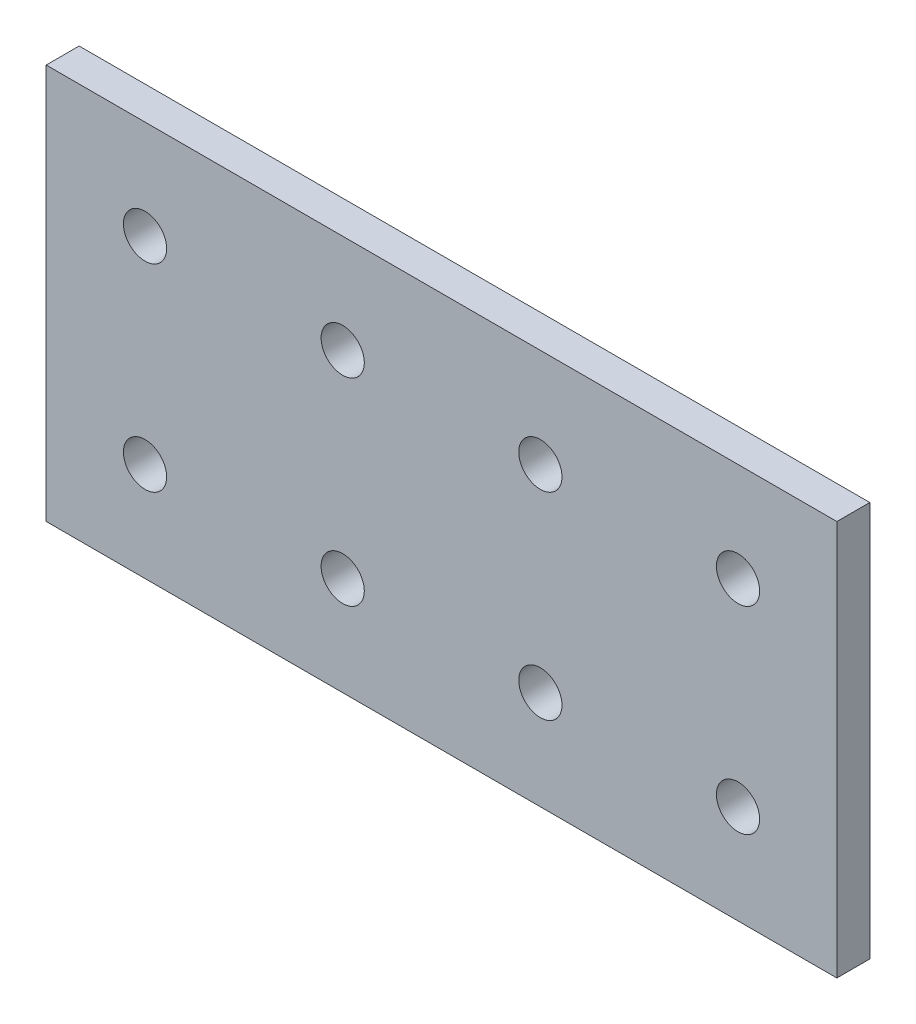
ISO-10303-21;
HEADER;
FILE_DESCRIPTION(('STEP AP214'),'2;1');
FILE_NAME('part.step','',(''),(''),'','','');
FILE_SCHEMA(('AUTOMOTIVE_DESIGN { 1 0 10303 214 1 1 1 1 }'));
ENDSEC;
DATA;
#1=APPLICATION_CONTEXT('core data for automotive mechanical design processes');
#2=APPLICATION_PROTOCOL_DEFINITION('international standard','automotive_design',2000,#1);
#3=PRODUCT_CONTEXT('',#1,'mechanical');
#4=PRODUCT('Part','Part','',(#3));
#5=PRODUCT_RELATED_PRODUCT_CATEGORY('part','',(#4));
#6=PRODUCT_DEFINITION_FORMATION('','',#4);
#7=PRODUCT_DEFINITION_CONTEXT('part definition',#1,'design');
#8=PRODUCT_DEFINITION('design','',#6,#7);
#9=PRODUCT_DEFINITION_SHAPE('','',#8);
#10=(LENGTH_UNIT() NAMED_UNIT(*) SI_UNIT(.MILLI.,.METRE.));
#11=(NAMED_UNIT(*) PLANE_ANGLE_UNIT() SI_UNIT($,.RADIAN.));
#12=(NAMED_UNIT(*) SI_UNIT($,.STERADIAN.) SOLID_ANGLE_UNIT());
#13=UNCERTAINTY_MEASURE_WITH_UNIT(LENGTH_MEASURE(1.E-05),#10,'distance_accuracy_value','');
#14=(GEOMETRIC_REPRESENTATION_CONTEXT(3) GLOBAL_UNCERTAINTY_ASSIGNED_CONTEXT((#13)) GLOBAL_UNIT_ASSIGNED_CONTEXT((#10,
#11,#12)) REPRESENTATION_CONTEXT('',''));
#15=CARTESIAN_POINT('',(0.,0.,0.));
#16=DIRECTION('',(0.,0.,1.));
#17=DIRECTION('',(1.,0.,0.));
#18=AXIS2_PLACEMENT_3D('',#15,#16,#17);
#19=CARTESIAN_POINT('',(0.,0.,3.175));
#20=DIRECTION('',(0.,0.,-1.));
#21=DIRECTION('',(-1.,0.,0.));
#22=AXIS2_PLACEMENT_3D('',#19,#20,#21);
#23=PLANE('',#22);
#24=CARTESIAN_POINT('',(95.25,57.15,3.175));
#25=DIRECTION('',(0.,0.,1.));
#26=DIRECTION('',(1.,0.,0.));
#27=AXIS2_PLACEMENT_3D('',#24,#25,#26);
#28=CIRCLE('',#27,4.1656);
#29=CARTESIAN_POINT('',(99.4156,57.15,3.175));
#30=VERTEX_POINT('',#29);
#31=EDGE_CURVE('E149',#30,#30,#28,.T.);
#32=ORIENTED_EDGE('',*,*,#31,.F.);
#33=EDGE_LOOP('',(#32));
#34=FACE_BOUND('',#33,.T.);
#35=CARTESIAN_POINT('',(19.05,57.15,3.175));
#36=DIRECTION('',(0.,0.,1.));
#37=DIRECTION('',(1.,0.,0.));
#38=AXIS2_PLACEMENT_3D('',#35,#36,#37);
#39=CIRCLE('',#38,4.1656);
#40=CARTESIAN_POINT('',(23.2156,57.15,3.175));
#41=VERTEX_POINT('',#40);
#42=EDGE_CURVE('E137',#41,#41,#39,.T.);
#43=ORIENTED_EDGE('',*,*,#42,.F.);
#44=EDGE_LOOP('',(#43));
#45=FACE_BOUND('',#44,.T.);
#46=CARTESIAN_POINT('',(95.25,19.05,3.175));
#47=DIRECTION('',(0.,0.,1.));
#48=DIRECTION('',(1.,0.,0.));
#49=AXIS2_PLACEMENT_3D('',#46,#47,#48);
#50=CIRCLE('',#49,4.1656);
#51=CARTESIAN_POINT('',(99.4156,19.05,3.175));
#52=VERTEX_POINT('',#51);
#53=EDGE_CURVE('E125',#52,#52,#50,.T.);
#54=ORIENTED_EDGE('',*,*,#53,.F.);
#55=EDGE_LOOP('',(#54));
#56=FACE_BOUND('',#55,.T.);
#57=CARTESIAN_POINT('',(19.05,19.05,3.175));
#58=DIRECTION('',(0.,0.,1.));
#59=DIRECTION('',(1.,0.,0.));
#60=AXIS2_PLACEMENT_3D('',#57,#58,#59);
#61=CIRCLE('',#60,4.1656);
#62=CARTESIAN_POINT('',(23.2156,19.05,3.175));
#63=VERTEX_POINT('',#62);
#64=EDGE_CURVE('E104',#63,#63,#61,.T.);
#65=ORIENTED_EDGE('',*,*,#64,.F.);
#66=EDGE_LOOP('',(#65));
#67=FACE_BOUND('',#66,.T.);
#68=DIRECTION('',(1.,0.,0.));
#69=VECTOR('',#68,1.);
#70=CARTESIAN_POINT('',(152.4,0.,3.175));
#71=LINE('',#70,#69);
#72=CARTESIAN_POINT('',(0.,0.,3.175));
#73=VERTEX_POINT('',#72);
#74=CARTESIAN_POINT('',(152.4,0.,3.175));
#75=VERTEX_POINT('',#74);
#76=EDGE_CURVE('E89',#73,#75,#71,.T.);
#77=ORIENTED_EDGE('',*,*,#76,.T.);
#78=DIRECTION('',(0.,1.,0.));
#79=VECTOR('',#78,1.);
#80=CARTESIAN_POINT('',(152.4,76.2,3.175));
#81=LINE('',#80,#79);
#82=CARTESIAN_POINT('',(152.4,76.2,3.175));
#83=VERTEX_POINT('',#82);
#84=EDGE_CURVE('E84',#75,#83,#81,.T.);
#85=ORIENTED_EDGE('',*,*,#84,.T.);
#86=DIRECTION('',(-1.,0.,0.));
#87=VECTOR('',#86,1.);
#88=CARTESIAN_POINT('',(152.4,76.2,3.175));
#89=LINE('',#88,#87);
#90=CARTESIAN_POINT('',(0.,76.2,3.175));
#91=VERTEX_POINT('',#90);
#92=EDGE_CURVE('E87',#83,#91,#89,.T.);
#93=ORIENTED_EDGE('',*,*,#92,.T.);
#94=DIRECTION('',(0.,-1.,0.));
#95=VECTOR('',#94,1.);
#96=CARTESIAN_POINT('',(0.,0.,3.175));
#97=LINE('',#96,#95);
#98=EDGE_CURVE('E54',#91,#73,#97,.T.);
#99=ORIENTED_EDGE('',*,*,#98,.T.);
#100=EDGE_LOOP('',(#77,#85,#93,#99));
#101=FACE_BOUND('',#100,.T.);
#102=CARTESIAN_POINT('',(57.15,19.05,3.175));
#103=DIRECTION('',(0.,0.,1.));
#104=DIRECTION('',(1.,0.,0.));
#105=AXIS2_PLACEMENT_3D('',#102,#103,#104);
#106=CIRCLE('',#105,4.1656);
#107=CARTESIAN_POINT('',(61.3156,19.05,3.175));
#108=VERTEX_POINT('',#107);
#109=EDGE_CURVE('E119',#108,#108,#106,.T.);
#110=ORIENTED_EDGE('',*,*,#109,.F.);
#111=EDGE_LOOP('',(#110));
#112=FACE_BOUND('',#111,.T.);
#113=CARTESIAN_POINT('',(133.35,19.05,3.175));
#114=DIRECTION('',(0.,0.,1.));
#115=DIRECTION('',(1.,0.,0.));
#116=AXIS2_PLACEMENT_3D('',#113,#114,#115);
#117=CIRCLE('',#116,4.1656);
#118=CARTESIAN_POINT('',(137.5156,19.05,3.175));
#119=VERTEX_POINT('',#118);
#120=EDGE_CURVE('E131',#119,#119,#117,.T.);
#121=ORIENTED_EDGE('',*,*,#120,.F.);
#122=EDGE_LOOP('',(#121));
#123=FACE_BOUND('',#122,.T.);
#124=CARTESIAN_POINT('',(57.15,57.15,3.175));
#125=DIRECTION('',(0.,0.,1.));
#126=DIRECTION('',(1.,0.,0.));
#127=AXIS2_PLACEMENT_3D('',#124,#125,#126);
#128=CIRCLE('',#127,4.1656);
#129=CARTESIAN_POINT('',(61.3156,57.15,3.175));
#130=VERTEX_POINT('',#129);
#131=EDGE_CURVE('E143',#130,#130,#128,.T.);
#132=ORIENTED_EDGE('',*,*,#131,.F.);
#133=EDGE_LOOP('',(#132));
#134=FACE_BOUND('',#133,.T.);
#135=CARTESIAN_POINT('',(133.35,57.15,3.175));
#136=DIRECTION('',(0.,0.,1.));
#137=DIRECTION('',(1.,0.,0.));
#138=AXIS2_PLACEMENT_3D('',#135,#136,#137);
#139=CIRCLE('',#138,4.1656);
#140=CARTESIAN_POINT('',(137.5156,57.15,3.175));
#141=VERTEX_POINT('',#140);
#142=EDGE_CURVE('E155',#141,#141,#139,.T.);
#143=ORIENTED_EDGE('',*,*,#142,.F.);
#144=EDGE_LOOP('',(#143));
#145=FACE_BOUND('',#144,.T.);
#146=ADVANCED_FACE('F37',(#34,#45,#56,#67,#101,#112,#123,#134,#145),#23,.F.);
#147=CARTESIAN_POINT('',(0.,0.,-3.175));
#148=DIRECTION('',(0.,0.,-1.));
#149=DIRECTION('',(-1.,0.,0.));
#150=AXIS2_PLACEMENT_3D('',#147,#148,#149);
#151=PLANE('',#150);
#152=CARTESIAN_POINT('',(95.25,57.15,-3.175));
#153=DIRECTION('',(0.,0.,1.));
#154=DIRECTION('',(1.,0.,0.));
#155=AXIS2_PLACEMENT_3D('',#152,#153,#154);
#156=CIRCLE('',#155,4.1656);
#157=CARTESIAN_POINT('',(99.4156,57.15,-3.175));
#158=VERTEX_POINT('',#157);
#159=EDGE_CURVE('E152',#158,#158,#156,.T.);
#160=ORIENTED_EDGE('',*,*,#159,.T.);
#161=EDGE_LOOP('',(#160));
#162=FACE_BOUND('',#161,.T.);
#163=CARTESIAN_POINT('',(19.05,57.15,-3.175));
#164=DIRECTION('',(0.,0.,1.));
#165=DIRECTION('',(1.,0.,0.));
#166=AXIS2_PLACEMENT_3D('',#163,#164,#165);
#167=CIRCLE('',#166,4.1656);
#168=CARTESIAN_POINT('',(23.2156,57.15,-3.175));
#169=VERTEX_POINT('',#168);
#170=EDGE_CURVE('E140',#169,#169,#167,.T.);
#171=ORIENTED_EDGE('',*,*,#170,.T.);
#172=EDGE_LOOP('',(#171));
#173=FACE_BOUND('',#172,.T.);
#174=CARTESIAN_POINT('',(95.25,19.05,-3.175));
#175=DIRECTION('',(0.,0.,1.));
#176=DIRECTION('',(1.,0.,0.));
#177=AXIS2_PLACEMENT_3D('',#174,#175,#176);
#178=CIRCLE('',#177,4.1656);
#179=CARTESIAN_POINT('',(99.4156,19.05,-3.175));
#180=VERTEX_POINT('',#179);
#181=EDGE_CURVE('E128',#180,#180,#178,.T.);
#182=ORIENTED_EDGE('',*,*,#181,.T.);
#183=EDGE_LOOP('',(#182));
#184=FACE_BOUND('',#183,.T.);
#185=CARTESIAN_POINT('',(19.05,19.05,-3.175));
#186=DIRECTION('',(0.,0.,1.));
#187=DIRECTION('',(1.,0.,0.));
#188=AXIS2_PLACEMENT_3D('',#185,#186,#187);
#189=CIRCLE('',#188,4.1656);
#190=CARTESIAN_POINT('',(23.2156,19.05,-3.175));
#191=VERTEX_POINT('',#190);
#192=EDGE_CURVE('E116',#191,#191,#189,.T.);
#193=ORIENTED_EDGE('',*,*,#192,.T.);
#194=EDGE_LOOP('',(#193));
#195=FACE_BOUND('',#194,.T.);
#196=DIRECTION('',(1.,0.,0.));
#197=VECTOR('',#196,1.);
#198=CARTESIAN_POINT('',(152.4,0.,-3.175));
#199=LINE('',#198,#197);
#200=CARTESIAN_POINT('',(0.,0.,-3.175));
#201=VERTEX_POINT('',#200);
#202=CARTESIAN_POINT('',(152.4,0.,-3.175));
#203=VERTEX_POINT('',#202);
#204=EDGE_CURVE('E101',#201,#203,#199,.T.);
#205=ORIENTED_EDGE('',*,*,#204,.F.);
#206=DIRECTION('',(0.,-1.,0.));
#207=VECTOR('',#206,1.);
#208=CARTESIAN_POINT('',(0.,0.,-3.175));
#209=LINE('',#208,#207);
#210=CARTESIAN_POINT('',(0.,76.2,-3.175));
#211=VERTEX_POINT('',#210);
#212=EDGE_CURVE('E77',#211,#201,#209,.T.);
#213=ORIENTED_EDGE('',*,*,#212,.F.);
#214=DIRECTION('',(-1.,0.,0.));
#215=VECTOR('',#214,1.);
#216=CARTESIAN_POINT('',(152.4,76.2,-3.175));
#217=LINE('',#216,#215);
#218=CARTESIAN_POINT('',(152.4,76.2,-3.175));
#219=VERTEX_POINT('',#218);
#220=EDGE_CURVE('E71',#219,#211,#217,.T.);
#221=ORIENTED_EDGE('',*,*,#220,.F.);
#222=DIRECTION('',(0.,1.,0.));
#223=VECTOR('',#222,1.);
#224=CARTESIAN_POINT('',(152.4,76.2,-3.175));
#225=LINE('',#224,#223);
#226=EDGE_CURVE('E93',#203,#219,#225,.T.);
#227=ORIENTED_EDGE('',*,*,#226,.F.);
#228=EDGE_LOOP('',(#205,#213,#221,#227));
#229=FACE_BOUND('',#228,.T.);
#230=CARTESIAN_POINT('',(57.15,19.05,-3.175));
#231=DIRECTION('',(0.,0.,1.));
#232=DIRECTION('',(1.,0.,0.));
#233=AXIS2_PLACEMENT_3D('',#230,#231,#232);
#234=CIRCLE('',#233,4.1656);
#235=CARTESIAN_POINT('',(61.3156,19.05,-3.175));
#236=VERTEX_POINT('',#235);
#237=EDGE_CURVE('E122',#236,#236,#234,.T.);
#238=ORIENTED_EDGE('',*,*,#237,.T.);
#239=EDGE_LOOP('',(#238));
#240=FACE_BOUND('',#239,.T.);
#241=CARTESIAN_POINT('',(133.35,19.05,-3.175));
#242=DIRECTION('',(0.,0.,1.));
#243=DIRECTION('',(1.,0.,0.));
#244=AXIS2_PLACEMENT_3D('',#241,#242,#243);
#245=CIRCLE('',#244,4.1656);
#246=CARTESIAN_POINT('',(137.5156,19.05,-3.175));
#247=VERTEX_POINT('',#246);
#248=EDGE_CURVE('E134',#247,#247,#245,.T.);
#249=ORIENTED_EDGE('',*,*,#248,.T.);
#250=EDGE_LOOP('',(#249));
#251=FACE_BOUND('',#250,.T.);
#252=CARTESIAN_POINT('',(57.15,57.15,-3.175));
#253=DIRECTION('',(0.,0.,1.));
#254=DIRECTION('',(1.,0.,0.));
#255=AXIS2_PLACEMENT_3D('',#252,#253,#254);
#256=CIRCLE('',#255,4.1656);
#257=CARTESIAN_POINT('',(61.3156,57.15,-3.175));
#258=VERTEX_POINT('',#257);
#259=EDGE_CURVE('E146',#258,#258,#256,.T.);
#260=ORIENTED_EDGE('',*,*,#259,.T.);
#261=EDGE_LOOP('',(#260));
#262=FACE_BOUND('',#261,.T.);
#263=CARTESIAN_POINT('',(133.35,57.15,-3.175));
#264=DIRECTION('',(0.,0.,1.));
#265=DIRECTION('',(1.,0.,0.));
#266=AXIS2_PLACEMENT_3D('',#263,#264,#265);
#267=CIRCLE('',#266,4.1656);
#268=CARTESIAN_POINT('',(137.5156,57.15,-3.175));
#269=VERTEX_POINT('',#268);
#270=EDGE_CURVE('E158',#269,#269,#267,.T.);
#271=ORIENTED_EDGE('',*,*,#270,.T.);
#272=EDGE_LOOP('',(#271));
#273=FACE_BOUND('',#272,.T.);
#274=ADVANCED_FACE('F112',(#162,#173,#184,#195,#229,#240,#251,#262,#273),#151,.T.);
#275=CARTESIAN_POINT('',(152.4,0.,3.175));
#276=DIRECTION('',(0.,1.,0.));
#277=DIRECTION('',(-1.,0.,0.));
#278=AXIS2_PLACEMENT_3D('',#275,#276,#277);
#279=PLANE('',#278);
#280=ORIENTED_EDGE('',*,*,#204,.T.);
#281=DIRECTION('',(0.,0.,-1.));
#282=VECTOR('',#281,1.);
#283=CARTESIAN_POINT('',(152.4,0.,3.175));
#284=LINE('',#283,#282);
#285=EDGE_CURVE('E11',#75,#203,#284,.T.);
#286=ORIENTED_EDGE('',*,*,#285,.F.);
#287=ORIENTED_EDGE('',*,*,#76,.F.);
#288=DIRECTION('',(0.,0.,-1.));
#289=VECTOR('',#288,1.);
#290=CARTESIAN_POINT('',(0.,0.,3.175));
#291=LINE('',#290,#289);
#292=EDGE_CURVE('E97',#73,#201,#291,.T.);
#293=ORIENTED_EDGE('',*,*,#292,.T.);
#294=EDGE_LOOP('',(#280,#286,#287,#293));
#295=FACE_BOUND('',#294,.T.);
#296=ADVANCED_FACE('F39',(#295),#279,.F.);
#297=CARTESIAN_POINT('',(152.4,76.2,3.175));
#298=DIRECTION('',(-1.,0.,0.));
#299=DIRECTION('',(0.,0.,1.));
#300=AXIS2_PLACEMENT_3D('',#297,#298,#299);
#301=PLANE('',#300);
#302=ORIENTED_EDGE('',*,*,#226,.T.);
#303=DIRECTION('',(0.,0.,-1.));
#304=VECTOR('',#303,1.);
#305=CARTESIAN_POINT('',(152.4,76.2,3.175));
#306=LINE('',#305,#304);
#307=EDGE_CURVE('E46',#83,#219,#306,.T.);
#308=ORIENTED_EDGE('',*,*,#307,.F.);
#309=ORIENTED_EDGE('',*,*,#84,.F.);
#310=ORIENTED_EDGE('',*,*,#285,.T.);
#311=EDGE_LOOP('',(#302,#308,#309,#310));
#312=FACE_BOUND('',#311,.T.);
#313=ADVANCED_FACE('F92',(#312),#301,.F.);
#314=CARTESIAN_POINT('',(152.4,76.2,3.175));
#315=DIRECTION('',(0.,-1.,0.));
#316=DIRECTION('',(1.,0.,0.));
#317=AXIS2_PLACEMENT_3D('',#314,#315,#316);
#318=PLANE('',#317);
#319=ORIENTED_EDGE('',*,*,#220,.T.);
#320=DIRECTION('',(0.,0.,-1.));
#321=VECTOR('',#320,1.);
#322=CARTESIAN_POINT('',(0.,76.2,3.175));
#323=LINE('',#322,#321);
#324=EDGE_CURVE('E94',#91,#211,#323,.T.);
#325=ORIENTED_EDGE('',*,*,#324,.F.);
#326=ORIENTED_EDGE('',*,*,#92,.F.);
#327=ORIENTED_EDGE('',*,*,#307,.T.);
#328=EDGE_LOOP('',(#319,#325,#326,#327));
#329=FACE_BOUND('',#328,.T.);
#330=ADVANCED_FACE('F95',(#329),#318,.F.);
#331=CARTESIAN_POINT('',(0.,0.,3.175));
#332=DIRECTION('',(1.,0.,0.));
#333=DIRECTION('',(0.,0.,-1.));
#334=AXIS2_PLACEMENT_3D('',#331,#332,#333);
#335=PLANE('',#334);
#336=ORIENTED_EDGE('',*,*,#212,.T.);
#337=ORIENTED_EDGE('',*,*,#292,.F.);
#338=ORIENTED_EDGE('',*,*,#98,.F.);
#339=ORIENTED_EDGE('',*,*,#324,.T.);
#340=EDGE_LOOP('',(#336,#337,#338,#339));
#341=FACE_BOUND('',#340,.T.);
#342=ADVANCED_FACE('F109',(#341),#335,.F.);
#343=CARTESIAN_POINT('',(19.05,19.05,3.175));
#344=DIRECTION('',(0.,0.,-1.));
#345=DIRECTION('',(-1.,0.,0.));
#346=AXIS2_PLACEMENT_3D('',#343,#344,#345);
#347=CYLINDRICAL_SURFACE('',#346,4.1656);
#348=ORIENTED_EDGE('',*,*,#64,.T.);
#349=EDGE_LOOP('',(#348));
#350=FACE_BOUND('',#349,.T.);
#351=ORIENTED_EDGE('',*,*,#192,.F.);
#352=EDGE_LOOP('',(#351));
#353=FACE_BOUND('',#352,.T.);
#354=ADVANCED_FACE('F178',(#350,#353),#347,.F.);
#355=CARTESIAN_POINT('',(57.15,19.05,3.175));
#356=DIRECTION('',(0.,0.,-1.));
#357=DIRECTION('',(-1.,0.,0.));
#358=AXIS2_PLACEMENT_3D('',#355,#356,#357);
#359=CYLINDRICAL_SURFACE('',#358,4.1656);
#360=ORIENTED_EDGE('',*,*,#109,.T.);
#361=EDGE_LOOP('',(#360));
#362=FACE_BOUND('',#361,.T.);
#363=ORIENTED_EDGE('',*,*,#237,.F.);
#364=EDGE_LOOP('',(#363));
#365=FACE_BOUND('',#364,.T.);
#366=ADVANCED_FACE('F224',(#362,#365),#359,.F.);
#367=CARTESIAN_POINT('',(95.25,19.05,3.175));
#368=DIRECTION('',(0.,0.,-1.));
#369=DIRECTION('',(-1.,0.,0.));
#370=AXIS2_PLACEMENT_3D('',#367,#368,#369);
#371=CYLINDRICAL_SURFACE('',#370,4.1656);
#372=ORIENTED_EDGE('',*,*,#53,.T.);
#373=EDGE_LOOP('',(#372));
#374=FACE_BOUND('',#373,.T.);
#375=ORIENTED_EDGE('',*,*,#181,.F.);
#376=EDGE_LOOP('',(#375));
#377=FACE_BOUND('',#376,.T.);
#378=ADVANCED_FACE('F232',(#374,#377),#371,.F.);
#379=CARTESIAN_POINT('',(133.35,19.05,3.175));
#380=DIRECTION('',(0.,0.,-1.));
#381=DIRECTION('',(-1.,0.,0.));
#382=AXIS2_PLACEMENT_3D('',#379,#380,#381);
#383=CYLINDRICAL_SURFACE('',#382,4.1656);
#384=ORIENTED_EDGE('',*,*,#120,.T.);
#385=EDGE_LOOP('',(#384));
#386=FACE_BOUND('',#385,.T.);
#387=ORIENTED_EDGE('',*,*,#248,.F.);
#388=EDGE_LOOP('',(#387));
#389=FACE_BOUND('',#388,.T.);
#390=ADVANCED_FACE('F240',(#386,#389),#383,.F.);
#391=CARTESIAN_POINT('',(19.05,57.15,3.175));
#392=DIRECTION('',(0.,0.,-1.));
#393=DIRECTION('',(-1.,0.,0.));
#394=AXIS2_PLACEMENT_3D('',#391,#392,#393);
#395=CYLINDRICAL_SURFACE('',#394,4.1656);
#396=ORIENTED_EDGE('',*,*,#42,.T.);
#397=EDGE_LOOP('',(#396));
#398=FACE_BOUND('',#397,.T.);
#399=ORIENTED_EDGE('',*,*,#170,.F.);
#400=EDGE_LOOP('',(#399));
#401=FACE_BOUND('',#400,.T.);
#402=ADVANCED_FACE('F249',(#398,#401),#395,.F.);
#403=CARTESIAN_POINT('',(57.15,57.15,3.175));
#404=DIRECTION('',(0.,0.,-1.));
#405=DIRECTION('',(-1.,0.,0.));
#406=AXIS2_PLACEMENT_3D('',#403,#404,#405);
#407=CYLINDRICAL_SURFACE('',#406,4.1656);
#408=ORIENTED_EDGE('',*,*,#131,.T.);
#409=EDGE_LOOP('',(#408));
#410=FACE_BOUND('',#409,.T.);
#411=ORIENTED_EDGE('',*,*,#259,.F.);
#412=EDGE_LOOP('',(#411));
#413=FACE_BOUND('',#412,.T.);
#414=ADVANCED_FACE('F258',(#410,#413),#407,.F.);
#415=CARTESIAN_POINT('',(95.25,57.15,3.175));
#416=DIRECTION('',(0.,0.,-1.));
#417=DIRECTION('',(-1.,0.,0.));
#418=AXIS2_PLACEMENT_3D('',#415,#416,#417);
#419=CYLINDRICAL_SURFACE('',#418,4.1656);
#420=ORIENTED_EDGE('',*,*,#31,.T.);
#421=EDGE_LOOP('',(#420));
#422=FACE_BOUND('',#421,.T.);
#423=ORIENTED_EDGE('',*,*,#159,.F.);
#424=EDGE_LOOP('',(#423));
#425=FACE_BOUND('',#424,.T.);
#426=ADVANCED_FACE('F267',(#422,#425),#419,.F.);
#427=CARTESIAN_POINT('',(133.35,57.15,3.175));
#428=DIRECTION('',(0.,0.,-1.));
#429=DIRECTION('',(-1.,0.,0.));
#430=AXIS2_PLACEMENT_3D('',#427,#428,#429);
#431=CYLINDRICAL_SURFACE('',#430,4.1656);
#432=ORIENTED_EDGE('',*,*,#142,.T.);
#433=EDGE_LOOP('',(#432));
#434=FACE_BOUND('',#433,.T.);
#435=ORIENTED_EDGE('',*,*,#270,.F.);
#436=EDGE_LOOP('',(#435));
#437=FACE_BOUND('',#436,.T.);
#438=ADVANCED_FACE('F164',(#434,#437),#431,.F.);
#439=CLOSED_SHELL('',(#146,#274,#296,#313,#330,#342,#354,#366,#378,#390,#402,#414,#426,#438));
#440=MANIFOLD_SOLID_BREP('B2',#439);
#441=ADVANCED_BREP_SHAPE_REPRESENTATION('',(#18,#440),#14);
#442=SHAPE_DEFINITION_REPRESENTATION(#9,#441);
ENDSEC;
END-ISO-10303-21;
